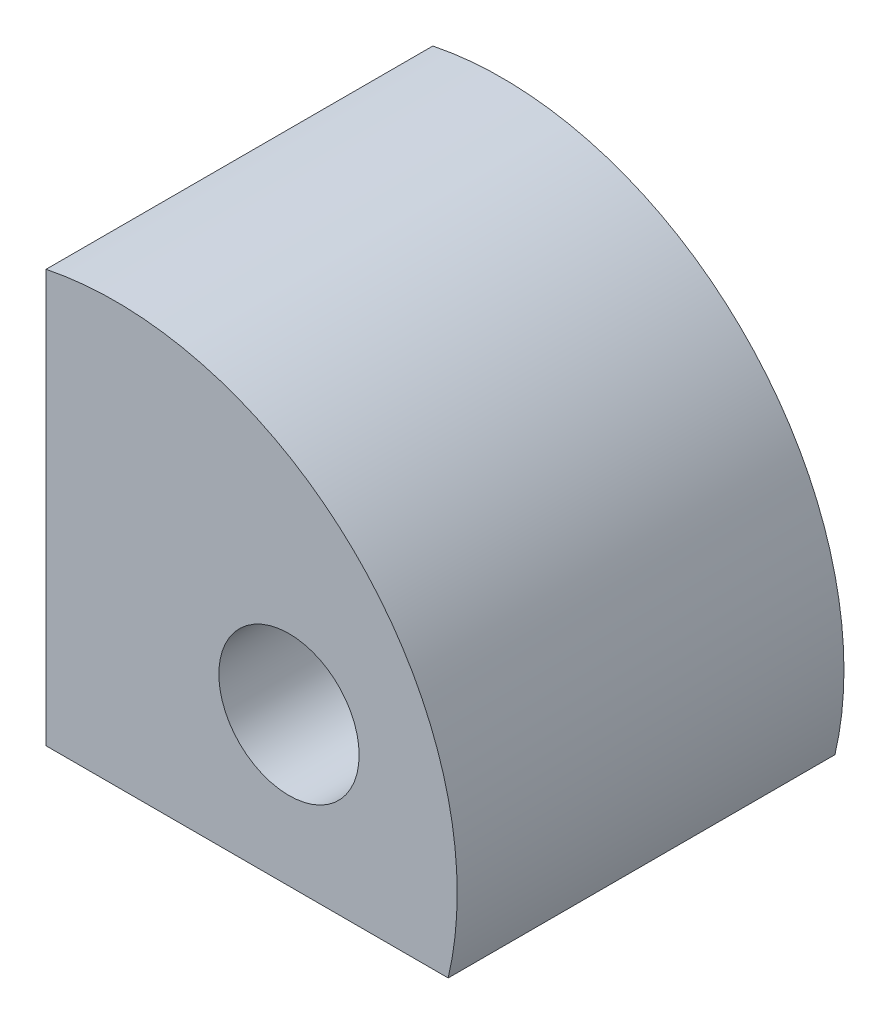
ISO-10303-21;
HEADER;
FILE_DESCRIPTION(('STEP AP214'),'2;1');
FILE_NAME('part.step','',(''),(''),'','','');
FILE_SCHEMA(('AUTOMOTIVE_DESIGN { 1 0 10303 214 1 1 1 1 }'));
ENDSEC;
DATA;
#1=APPLICATION_CONTEXT('core data for automotive mechanical design processes');
#2=APPLICATION_PROTOCOL_DEFINITION('international standard','automotive_design',2000,#1);
#3=PRODUCT_CONTEXT('',#1,'mechanical');
#4=PRODUCT('Part','Part','',(#3));
#5=PRODUCT_RELATED_PRODUCT_CATEGORY('part','',(#4));
#6=PRODUCT_DEFINITION_FORMATION('','',#4);
#7=PRODUCT_DEFINITION_CONTEXT('part definition',#1,'design');
#8=PRODUCT_DEFINITION('design','',#6,#7);
#9=PRODUCT_DEFINITION_SHAPE('','',#8);
#10=(LENGTH_UNIT() NAMED_UNIT(*) SI_UNIT(.MILLI.,.METRE.));
#11=(NAMED_UNIT(*) PLANE_ANGLE_UNIT() SI_UNIT($,.RADIAN.));
#12=(NAMED_UNIT(*) SI_UNIT($,.STERADIAN.) SOLID_ANGLE_UNIT());
#13=UNCERTAINTY_MEASURE_WITH_UNIT(LENGTH_MEASURE(1.E-05),#10,'distance_accuracy_value','');
#14=(GEOMETRIC_REPRESENTATION_CONTEXT(3) GLOBAL_UNCERTAINTY_ASSIGNED_CONTEXT((#13)) GLOBAL_UNIT_ASSIGNED_CONTEXT((#10,
#11,#12)) REPRESENTATION_CONTEXT('',''));
#15=CARTESIAN_POINT('',(0.,0.,0.));
#16=DIRECTION('',(0.,0.,1.));
#17=DIRECTION('',(1.,0.,0.));
#18=AXIS2_PLACEMENT_3D('',#15,#16,#17);
#19=CARTESIAN_POINT('',(-1.2151235167292,-2.86143504016257,9.37333333333333));
#20=DIRECTION('',(0.,0.,1.));
#21=DIRECTION('',(1.,0.,0.));
#22=AXIS2_PLACEMENT_3D('',#19,#20,#21);
#23=PLANE('',#22);
#24=CARTESIAN_POINT('',(-1.2151235167292,-2.86143504016257,9.37333333333333));
#25=DIRECTION('',(0.,0.,1.));
#26=DIRECTION('',(1.,0.,0.));
#27=AXIS2_PLACEMENT_3D('',#24,#25,#26);
#28=CIRCLE('',#27,8.28554143514574);
#29=CARTESIAN_POINT('',(6.85253507844266,-4.74904772958444,9.37333333333333));
#30=VERTEX_POINT('',#29);
#31=CARTESIAN_POINT('',(-2.89418707960662,5.25219191856151,9.37333333333333));
#32=VERTEX_POINT('',#31);
#33=EDGE_CURVE('E82',#30,#32,#28,.T.);
#34=ORIENTED_EDGE('',*,*,#33,.T.);
#35=DIRECTION('',(0.,-1.,0.));
#36=VECTOR('',#35,1.);
#37=CARTESIAN_POINT('',(-2.89418707960662,5.25219191856151,9.37333333333333));
#38=LINE('',#37,#36);
#39=CARTESIAN_POINT('',(-2.89418707960662,-4.74904772958444,9.37333333333333));
#40=VERTEX_POINT('',#39);
#41=EDGE_CURVE('E77',#32,#40,#38,.T.);
#42=ORIENTED_EDGE('',*,*,#41,.T.);
#43=DIRECTION('',(1.,0.,0.));
#44=VECTOR('',#43,1.);
#45=CARTESIAN_POINT('',(6.85253507844266,-4.74904772958444,9.37333333333333));
#46=LINE('',#45,#44);
#47=EDGE_CURVE('E57',#40,#30,#46,.T.);
#48=ORIENTED_EDGE('',*,*,#47,.T.);
#49=EDGE_LOOP('',(#34,#42,#48));
#50=FACE_BOUND('',#49,.T.);
#51=CARTESIAN_POINT('',(2.99372427545906,-1.14904772958444,9.37333333333333));
#52=DIRECTION('',(0.,0.,1.));
#53=DIRECTION('',(1.,0.,0.));
#54=AXIS2_PLACEMENT_3D('',#51,#52,#53);
#55=CIRCLE('',#54,1.7);
#56=CARTESIAN_POINT('',(4.69372427545906,-1.14904772958444,9.37333333333333));
#57=VERTEX_POINT('',#56);
#58=EDGE_CURVE('E94',#57,#57,#55,.T.);
#59=ORIENTED_EDGE('',*,*,#58,.F.);
#60=EDGE_LOOP('',(#59));
#61=FACE_BOUND('',#60,.T.);
#62=ADVANCED_FACE('F39',(#50,#61),#23,.T.);
#63=CARTESIAN_POINT('',(-1.2151235167292,-2.86143504016257,0.));
#64=DIRECTION('',(0.,0.,1.));
#65=DIRECTION('',(1.,0.,0.));
#66=AXIS2_PLACEMENT_3D('',#63,#64,#65);
#67=PLANE('',#66);
#68=CARTESIAN_POINT('',(-1.2151235167292,-2.86143504016257,0.));
#69=DIRECTION('',(0.,0.,1.));
#70=DIRECTION('',(1.,0.,0.));
#71=AXIS2_PLACEMENT_3D('',#68,#69,#70);
#72=CIRCLE('',#71,8.28554143514574);
#73=CARTESIAN_POINT('',(6.85253507844266,-4.74904772958444,0.));
#74=VERTEX_POINT('',#73);
#75=CARTESIAN_POINT('',(-2.89418707960662,5.25219191856151,0.));
#76=VERTEX_POINT('',#75);
#77=EDGE_CURVE('E90',#74,#76,#72,.T.);
#78=ORIENTED_EDGE('',*,*,#77,.F.);
#79=DIRECTION('',(1.,0.,0.));
#80=VECTOR('',#79,1.);
#81=CARTESIAN_POINT('',(6.85253507844266,-4.74904772958444,0.));
#82=LINE('',#81,#80);
#83=CARTESIAN_POINT('',(-2.89418707960662,-4.74904772958444,0.));
#84=VERTEX_POINT('',#83);
#85=EDGE_CURVE('E74',#84,#74,#82,.T.);
#86=ORIENTED_EDGE('',*,*,#85,.F.);
#87=DIRECTION('',(0.,-1.,0.));
#88=VECTOR('',#87,1.);
#89=CARTESIAN_POINT('',(-2.89418707960662,5.25219191856151,0.));
#90=LINE('',#89,#88);
#91=EDGE_CURVE('E69',#76,#84,#90,.T.);
#92=ORIENTED_EDGE('',*,*,#91,.F.);
#93=EDGE_LOOP('',(#78,#86,#92));
#94=FACE_BOUND('',#93,.T.);
#95=CARTESIAN_POINT('',(2.99372427545906,-1.14904772958444,0.));
#96=DIRECTION('',(0.,0.,1.));
#97=DIRECTION('',(1.,0.,0.));
#98=AXIS2_PLACEMENT_3D('',#95,#96,#97);
#99=CIRCLE('',#98,1.7);
#100=CARTESIAN_POINT('',(4.69372427545906,-1.14904772958444,0.));
#101=VERTEX_POINT('',#100);
#102=EDGE_CURVE('E100',#101,#101,#99,.T.);
#103=ORIENTED_EDGE('',*,*,#102,.T.);
#104=EDGE_LOOP('',(#103));
#105=FACE_BOUND('',#104,.T.);
#106=ADVANCED_FACE('F109',(#94,#105),#67,.F.);
#107=CARTESIAN_POINT('',(-1.2151235167292,-2.86143504016257,9.37333333333333));
#108=DIRECTION('',(0.,0.,-1.));
#109=DIRECTION('',(-1.,0.,0.));
#110=AXIS2_PLACEMENT_3D('',#107,#108,#109);
#111=CYLINDRICAL_SURFACE('',#110,8.28554143514574);
#112=ORIENTED_EDGE('',*,*,#77,.T.);
#113=DIRECTION('',(0.,0.,-1.));
#114=VECTOR('',#113,1.);
#115=CARTESIAN_POINT('',(-2.89418707960662,5.25219191856151,9.37333333333333));
#116=LINE('',#115,#114);
#117=EDGE_CURVE('E11',#32,#76,#116,.T.);
#118=ORIENTED_EDGE('',*,*,#117,.F.);
#119=ORIENTED_EDGE('',*,*,#33,.F.);
#120=DIRECTION('',(0.,0.,-1.));
#121=VECTOR('',#120,1.);
#122=CARTESIAN_POINT('',(6.85253507844266,-4.74904772958444,9.37333333333333));
#123=LINE('',#122,#121);
#124=EDGE_CURVE('E91',#30,#74,#123,.T.);
#125=ORIENTED_EDGE('',*,*,#124,.T.);
#126=EDGE_LOOP('',(#112,#118,#119,#125));
#127=FACE_BOUND('',#126,.T.);
#128=ADVANCED_FACE('F41',(#127),#111,.T.);
#129=CARTESIAN_POINT('',(-2.89418707960662,5.25219191856151,9.37333333333333));
#130=DIRECTION('',(1.,0.,0.));
#131=DIRECTION('',(0.,0.,-1.));
#132=AXIS2_PLACEMENT_3D('',#129,#130,#131);
#133=PLANE('',#132);
#134=ORIENTED_EDGE('',*,*,#91,.T.);
#135=DIRECTION('',(0.,0.,-1.));
#136=VECTOR('',#135,1.);
#137=CARTESIAN_POINT('',(-2.89418707960662,-4.74904772958444,9.37333333333333));
#138=LINE('',#137,#136);
#139=EDGE_CURVE('E49',#40,#84,#138,.T.);
#140=ORIENTED_EDGE('',*,*,#139,.F.);
#141=ORIENTED_EDGE('',*,*,#41,.F.);
#142=ORIENTED_EDGE('',*,*,#117,.T.);
#143=EDGE_LOOP('',(#134,#140,#141,#142));
#144=FACE_BOUND('',#143,.T.);
#145=ADVANCED_FACE('F78',(#144),#133,.F.);
#146=CARTESIAN_POINT('',(6.85253507844266,-4.74904772958444,9.37333333333333));
#147=DIRECTION('',(0.,1.,0.));
#148=DIRECTION('',(0.,0.,1.));
#149=AXIS2_PLACEMENT_3D('',#146,#147,#148);
#150=PLANE('',#149);
#151=ORIENTED_EDGE('',*,*,#85,.T.);
#152=ORIENTED_EDGE('',*,*,#124,.F.);
#153=ORIENTED_EDGE('',*,*,#47,.F.);
#154=ORIENTED_EDGE('',*,*,#139,.T.);
#155=EDGE_LOOP('',(#151,#152,#153,#154));
#156=FACE_BOUND('',#155,.T.);
#157=ADVANCED_FACE('F108',(#156),#150,.F.);
#158=CARTESIAN_POINT('',(2.99372427545906,-1.14904772958444,9.37333333333333));
#159=DIRECTION('',(0.,0.,-1.));
#160=DIRECTION('',(-1.,0.,0.));
#161=AXIS2_PLACEMENT_3D('',#158,#159,#160);
#162=CYLINDRICAL_SURFACE('',#161,1.7);
#163=ORIENTED_EDGE('',*,*,#58,.T.);
#164=EDGE_LOOP('',(#163));
#165=FACE_BOUND('',#164,.T.);
#166=ORIENTED_EDGE('',*,*,#102,.F.);
#167=EDGE_LOOP('',(#166));
#168=FACE_BOUND('',#167,.T.);
#169=ADVANCED_FACE('F118',(#165,#168),#162,.F.);
#170=CLOSED_SHELL('',(#62,#106,#128,#145,#157,#169));
#171=MANIFOLD_SOLID_BREP('B2',#170);
#172=ADVANCED_BREP_SHAPE_REPRESENTATION('',(#18,#171),#14);
#173=SHAPE_DEFINITION_REPRESENTATION(#9,#172);
ENDSEC;
END-ISO-10303-21;
